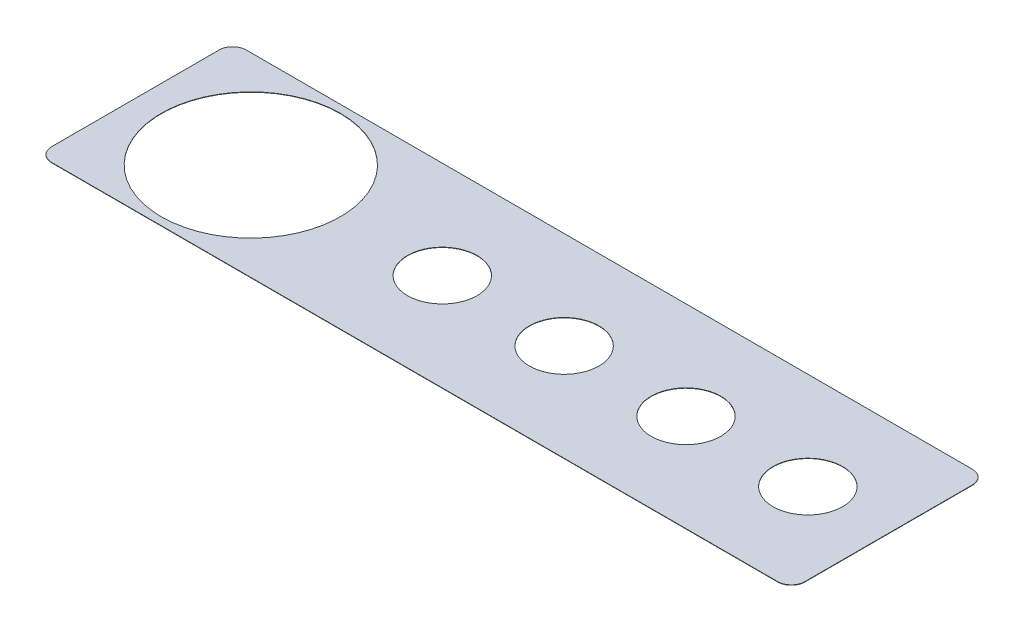
ISO-10303-21;
HEADER;
FILE_DESCRIPTION(('STEP AP214'),'2;1');
FILE_NAME('part.step','',(''),(''),'','','');
FILE_SCHEMA(('AUTOMOTIVE_DESIGN { 1 0 10303 214 1 1 1 1 }'));
ENDSEC;
DATA;
#1=APPLICATION_CONTEXT('core data for automotive mechanical design processes');
#2=APPLICATION_PROTOCOL_DEFINITION('international standard','automotive_design',2000,#1);
#3=PRODUCT_CONTEXT('',#1,'mechanical');
#4=PRODUCT('Part','Part','',(#3));
#5=PRODUCT_RELATED_PRODUCT_CATEGORY('part','',(#4));
#6=PRODUCT_DEFINITION_FORMATION('','',#4);
#7=PRODUCT_DEFINITION_CONTEXT('part definition',#1,'design');
#8=PRODUCT_DEFINITION('design','',#6,#7);
#9=PRODUCT_DEFINITION_SHAPE('','',#8);
#10=(LENGTH_UNIT() NAMED_UNIT(*) SI_UNIT(.MILLI.,.METRE.));
#11=(NAMED_UNIT(*) PLANE_ANGLE_UNIT() SI_UNIT($,.RADIAN.));
#12=(NAMED_UNIT(*) SI_UNIT($,.STERADIAN.) SOLID_ANGLE_UNIT());
#13=UNCERTAINTY_MEASURE_WITH_UNIT(LENGTH_MEASURE(1.E-05),#10,'distance_accuracy_value','');
#14=(GEOMETRIC_REPRESENTATION_CONTEXT(3) GLOBAL_UNCERTAINTY_ASSIGNED_CONTEXT((#13)) GLOBAL_UNIT_ASSIGNED_CONTEXT((#10,
#11,#12)) REPRESENTATION_CONTEXT('',''));
#15=CARTESIAN_POINT('',(0.,0.,0.));
#16=DIRECTION('',(0.,0.,1.));
#17=DIRECTION('',(1.,0.,0.));
#18=AXIS2_PLACEMENT_3D('',#15,#16,#17);
#19=CARTESIAN_POINT('',(-72.805846626015,0.1,-6.62830389262491));
#20=DIRECTION('',(0.,1.,0.));
#21=DIRECTION('',(0.,0.,1.));
#22=AXIS2_PLACEMENT_3D('',#19,#20,#21);
#23=PLANE('',#22);
#24=CARTESIAN_POINT('',(11.4619708276482,0.1,17.4315257475565));
#25=DIRECTION('',(0.,1.,0.));
#26=DIRECTION('',(0.,0.,1.));
#27=AXIS2_PLACEMENT_3D('',#24,#25,#26);
#28=CIRCLE('',#27,10.);
#29=CARTESIAN_POINT('',(11.4619708276482,0.1,27.4315257475565));
#30=VERTEX_POINT('',#29);
#31=EDGE_CURVE('E215',#30,#30,#28,.T.);
#32=ORIENTED_EDGE('',*,*,#31,.F.);
#33=EDGE_LOOP('',(#32));
#34=FACE_BOUND('',#33,.T.);
#35=CARTESIAN_POINT('',(46.4619708276482,0.1,17.4315257475565));
#36=DIRECTION('',(0.,1.,0.));
#37=DIRECTION('',(0.,0.,1.));
#38=AXIS2_PLACEMENT_3D('',#35,#36,#37);
#39=CIRCLE('',#38,10.);
#40=CARTESIAN_POINT('',(46.4619708276482,0.1,27.4315257475565));
#41=VERTEX_POINT('',#40);
#42=EDGE_CURVE('E222',#41,#41,#39,.T.);
#43=ORIENTED_EDGE('',*,*,#42,.F.);
#44=EDGE_LOOP('',(#43));
#45=FACE_BOUND('',#44,.T.);
#46=CARTESIAN_POINT('',(81.4619708276482,0.1,17.4315257475565));
#47=DIRECTION('',(0.,1.,0.));
#48=DIRECTION('',(0.,0.,1.));
#49=AXIS2_PLACEMENT_3D('',#46,#47,#48);
#50=CIRCLE('',#49,9.99999999999999);
#51=CARTESIAN_POINT('',(81.4619708276482,0.1,27.4315257475565));
#52=VERTEX_POINT('',#51);
#53=EDGE_CURVE('E226',#52,#52,#50,.T.);
#54=ORIENTED_EDGE('',*,*,#53,.F.);
#55=EDGE_LOOP('',(#54));
#56=FACE_BOUND('',#55,.T.);
#57=CARTESIAN_POINT('',(116.461970827648,0.1,17.4315257475565));
#58=DIRECTION('',(0.,1.,0.));
#59=DIRECTION('',(0.,0.,1.));
#60=AXIS2_PLACEMENT_3D('',#57,#58,#59);
#61=CIRCLE('',#60,10.);
#62=CARTESIAN_POINT('',(116.461970827648,0.1,27.4315257475565));
#63=VERTEX_POINT('',#62);
#64=EDGE_CURVE('E230',#63,#63,#61,.T.);
#65=ORIENTED_EDGE('',*,*,#64,.F.);
#66=EDGE_LOOP('',(#65));
#67=FACE_BOUND('',#66,.T.);
#68=CARTESIAN_POINT('',(-72.805846626015,0.1,-6.62830389262491));
#69=DIRECTION('',(0.,1.,0.));
#70=DIRECTION('',(0.,0.,1.));
#71=AXIS2_PLACEMENT_3D('',#68,#69,#70);
#72=CIRCLE('',#71,3.9);
#73=CARTESIAN_POINT('',(-72.805846626015,0.1,-10.5283038926249));
#74=VERTEX_POINT('',#73);
#75=CARTESIAN_POINT('',(-76.705846626015,0.1,-6.62830389262487));
#76=VERTEX_POINT('',#75);
#77=EDGE_CURVE('E166',#74,#76,#72,.T.);
#78=ORIENTED_EDGE('',*,*,#77,.T.);
#79=DIRECTION('',(0.,0.,1.));
#80=VECTOR('',#79,1.);
#81=CARTESIAN_POINT('',(-76.705846626015,0.1,-6.62830389262487));
#82=LINE('',#81,#80);
#83=CARTESIAN_POINT('',(-76.705846626015,0.1,41.4913553877378));
#84=VERTEX_POINT('',#83);
#85=EDGE_CURVE('E102',#76,#84,#82,.T.);
#86=ORIENTED_EDGE('',*,*,#85,.T.);
#87=CARTESIAN_POINT('',(-72.805846626015,0.1,41.4913553877379));
#88=DIRECTION('',(0.,1.,0.));
#89=DIRECTION('',(0.,0.,1.));
#90=AXIS2_PLACEMENT_3D('',#87,#88,#89);
#91=CIRCLE('',#90,3.9);
#92=CARTESIAN_POINT('',(-72.805846626015,0.1,45.3913553877379));
#93=VERTEX_POINT('',#92);
#94=EDGE_CURVE('E187',#84,#93,#91,.T.);
#95=ORIENTED_EDGE('',*,*,#94,.T.);
#96=DIRECTION('',(1.,0.,0.));
#97=VECTOR('',#96,1.);
#98=CARTESIAN_POINT('',(-72.805846626015,0.1,45.3913553877379));
#99=LINE('',#98,#97);
#100=CARTESIAN_POINT('',(135.779788281311,0.1,45.3913553877379));
#101=VERTEX_POINT('',#100);
#102=EDGE_CURVE('E201',#93,#101,#99,.T.);
#103=ORIENTED_EDGE('',*,*,#102,.T.);
#104=CARTESIAN_POINT('',(135.779788281311,0.1,41.4913553877379));
#105=DIRECTION('',(0.,1.,0.));
#106=DIRECTION('',(0.,0.,1.));
#107=AXIS2_PLACEMENT_3D('',#104,#105,#106);
#108=CIRCLE('',#107,3.90000000000001);
#109=CARTESIAN_POINT('',(139.679788281311,0.1,41.4913553877379));
#110=VERTEX_POINT('',#109);
#111=EDGE_CURVE('E121',#101,#110,#108,.T.);
#112=ORIENTED_EDGE('',*,*,#111,.T.);
#113=DIRECTION('',(0.,0.,-1.));
#114=VECTOR('',#113,1.);
#115=CARTESIAN_POINT('',(139.679788281311,0.1,41.4913553877379));
#116=LINE('',#115,#114);
#117=CARTESIAN_POINT('',(139.679788281311,0.1,-6.62830389262491));
#118=VERTEX_POINT('',#117);
#119=EDGE_CURVE('E115',#110,#118,#116,.T.);
#120=ORIENTED_EDGE('',*,*,#119,.T.);
#121=CARTESIAN_POINT('',(135.779788281311,0.1,-6.62830389262497));
#122=DIRECTION('',(0.,1.,0.));
#123=DIRECTION('',(0.,0.,1.));
#124=AXIS2_PLACEMENT_3D('',#121,#122,#123);
#125=CIRCLE('',#124,3.90000000000001);
#126=CARTESIAN_POINT('',(135.779788281311,0.1,-10.528303892625));
#127=VERTEX_POINT('',#126);
#128=EDGE_CURVE('E119',#118,#127,#125,.T.);
#129=ORIENTED_EDGE('',*,*,#128,.T.);
#130=DIRECTION('',(-1.,0.,0.));
#131=VECTOR('',#130,1.);
#132=CARTESIAN_POINT('',(135.779788281311,0.1,-10.528303892625));
#133=LINE('',#132,#131);
#134=EDGE_CURVE('E59',#127,#74,#133,.T.);
#135=ORIENTED_EDGE('',*,*,#134,.T.);
#136=EDGE_LOOP('',(#78,#86,#95,#103,#112,#120,#129,#135));
#137=FACE_BOUND('',#136,.T.);
#138=CARTESIAN_POINT('',(-43.5380291723518,0.1,17.4315257475565));
#139=DIRECTION('',(0.,1.,0.));
#140=DIRECTION('',(0.,0.,1.));
#141=AXIS2_PLACEMENT_3D('',#138,#139,#140);
#142=CIRCLE('',#141,25.7363341911249);
#143=CARTESIAN_POINT('',(-43.5380291723518,0.1,43.1678599386814));
#144=VERTEX_POINT('',#143);
#145=EDGE_CURVE('E148',#144,#144,#142,.T.);
#146=ORIENTED_EDGE('',*,*,#145,.F.);
#147=EDGE_LOOP('',(#146));
#148=FACE_BOUND('',#147,.T.);
#149=ADVANCED_FACE('F41',(#34,#45,#56,#67,#137,#148),#23,.T.);
#150=CARTESIAN_POINT('',(-72.805846626015,0.,-6.62830389262491));
#151=DIRECTION('',(0.,1.,0.));
#152=DIRECTION('',(0.,0.,1.));
#153=AXIS2_PLACEMENT_3D('',#150,#151,#152);
#154=PLANE('',#153);
#155=CARTESIAN_POINT('',(11.4619708276482,0.,17.4315257475565));
#156=DIRECTION('',(0.,1.,0.));
#157=DIRECTION('',(0.,0.,1.));
#158=AXIS2_PLACEMENT_3D('',#155,#156,#157);
#159=CIRCLE('',#158,10.);
#160=CARTESIAN_POINT('',(11.4619708276482,0.,27.4315257475565));
#161=VERTEX_POINT('',#160);
#162=EDGE_CURVE('E234',#161,#161,#159,.T.);
#163=ORIENTED_EDGE('',*,*,#162,.T.);
#164=EDGE_LOOP('',(#163));
#165=FACE_BOUND('',#164,.T.);
#166=CARTESIAN_POINT('',(46.4619708276482,0.,17.4315257475565));
#167=DIRECTION('',(0.,1.,0.));
#168=DIRECTION('',(0.,0.,1.));
#169=AXIS2_PLACEMENT_3D('',#166,#167,#168);
#170=CIRCLE('',#169,10.);
#171=CARTESIAN_POINT('',(46.4619708276482,0.,27.4315257475565));
#172=VERTEX_POINT('',#171);
#173=EDGE_CURVE('E243',#172,#172,#170,.T.);
#174=ORIENTED_EDGE('',*,*,#173,.T.);
#175=EDGE_LOOP('',(#174));
#176=FACE_BOUND('',#175,.T.);
#177=CARTESIAN_POINT('',(81.4619708276482,0.,17.4315257475565));
#178=DIRECTION('',(0.,1.,0.));
#179=DIRECTION('',(0.,0.,1.));
#180=AXIS2_PLACEMENT_3D('',#177,#178,#179);
#181=CIRCLE('',#180,9.99999999999999);
#182=CARTESIAN_POINT('',(81.4619708276482,0.,27.4315257475565));
#183=VERTEX_POINT('',#182);
#184=EDGE_CURVE('E239',#183,#183,#181,.T.);
#185=ORIENTED_EDGE('',*,*,#184,.T.);
#186=EDGE_LOOP('',(#185));
#187=FACE_BOUND('',#186,.T.);
#188=CARTESIAN_POINT('',(116.461970827648,0.,17.4315257475565));
#189=DIRECTION('',(0.,1.,0.));
#190=DIRECTION('',(0.,0.,1.));
#191=AXIS2_PLACEMENT_3D('',#188,#189,#190);
#192=CIRCLE('',#191,10.);
#193=CARTESIAN_POINT('',(116.461970827648,0.,27.4315257475565));
#194=VERTEX_POINT('',#193);
#195=EDGE_CURVE('E235',#194,#194,#192,.T.);
#196=ORIENTED_EDGE('',*,*,#195,.T.);
#197=EDGE_LOOP('',(#196));
#198=FACE_BOUND('',#197,.T.);
#199=CARTESIAN_POINT('',(-72.805846626015,0.,-6.62830389262491));
#200=DIRECTION('',(0.,1.,0.));
#201=DIRECTION('',(0.,0.,1.));
#202=AXIS2_PLACEMENT_3D('',#199,#200,#201);
#203=CIRCLE('',#202,3.9);
#204=CARTESIAN_POINT('',(-72.805846626015,0.,-10.5283038926249));
#205=VERTEX_POINT('',#204);
#206=CARTESIAN_POINT('',(-76.705846626015,0.,-6.62830389262487));
#207=VERTEX_POINT('',#206);
#208=EDGE_CURVE('E143',#205,#207,#203,.T.);
#209=ORIENTED_EDGE('',*,*,#208,.F.);
#210=DIRECTION('',(-1.,0.,0.));
#211=VECTOR('',#210,1.);
#212=CARTESIAN_POINT('',(135.779788281311,0.,-10.528303892625));
#213=LINE('',#212,#211);
#214=CARTESIAN_POINT('',(135.779788281311,0.,-10.528303892625));
#215=VERTEX_POINT('',#214);
#216=EDGE_CURVE('E94',#215,#205,#213,.T.);
#217=ORIENTED_EDGE('',*,*,#216,.F.);
#218=CARTESIAN_POINT('',(135.779788281311,0.,-6.62830389262497));
#219=DIRECTION('',(0.,1.,0.));
#220=DIRECTION('',(0.,0.,1.));
#221=AXIS2_PLACEMENT_3D('',#218,#219,#220);
#222=CIRCLE('',#221,3.90000000000001);
#223=CARTESIAN_POINT('',(139.679788281311,0.,-6.62830389262491));
#224=VERTEX_POINT('',#223);
#225=EDGE_CURVE('E88',#224,#215,#222,.T.);
#226=ORIENTED_EDGE('',*,*,#225,.F.);
#227=DIRECTION('',(0.,0.,-1.));
#228=VECTOR('',#227,1.);
#229=CARTESIAN_POINT('',(139.679788281311,0.,41.4913553877379));
#230=LINE('',#229,#228);
#231=CARTESIAN_POINT('',(139.679788281311,0.,41.4913553877379));
#232=VERTEX_POINT('',#231);
#233=EDGE_CURVE('E130',#232,#224,#230,.T.);
#234=ORIENTED_EDGE('',*,*,#233,.F.);
#235=CARTESIAN_POINT('',(135.779788281311,0.,41.4913553877379));
#236=DIRECTION('',(0.,1.,0.));
#237=DIRECTION('',(0.,0.,1.));
#238=AXIS2_PLACEMENT_3D('',#235,#236,#237);
#239=CIRCLE('',#238,3.90000000000001);
#240=CARTESIAN_POINT('',(135.779788281311,0.,45.3913553877379));
#241=VERTEX_POINT('',#240);
#242=EDGE_CURVE('E157',#241,#232,#239,.T.);
#243=ORIENTED_EDGE('',*,*,#242,.F.);
#244=DIRECTION('',(1.,0.,0.));
#245=VECTOR('',#244,1.);
#246=CARTESIAN_POINT('',(-72.805846626015,0.,45.3913553877379));
#247=LINE('',#246,#245);
#248=CARTESIAN_POINT('',(-72.805846626015,0.,45.3913553877379));
#249=VERTEX_POINT('',#248);
#250=EDGE_CURVE('E154',#249,#241,#247,.T.);
#251=ORIENTED_EDGE('',*,*,#250,.F.);
#252=CARTESIAN_POINT('',(-72.805846626015,0.,41.4913553877379));
#253=DIRECTION('',(0.,1.,0.));
#254=DIRECTION('',(0.,0.,1.));
#255=AXIS2_PLACEMENT_3D('',#252,#253,#254);
#256=CIRCLE('',#255,3.9);
#257=CARTESIAN_POINT('',(-76.705846626015,0.,41.4913553877378));
#258=VERTEX_POINT('',#257);
#259=EDGE_CURVE('E151',#258,#249,#256,.T.);
#260=ORIENTED_EDGE('',*,*,#259,.F.);
#261=DIRECTION('',(0.,0.,1.));
#262=VECTOR('',#261,1.);
#263=CARTESIAN_POINT('',(-76.705846626015,0.,-6.62830389262487));
#264=LINE('',#263,#262);
#265=EDGE_CURVE('E147',#207,#258,#264,.T.);
#266=ORIENTED_EDGE('',*,*,#265,.F.);
#267=EDGE_LOOP('',(#209,#217,#226,#234,#243,#251,#260,#266));
#268=FACE_BOUND('',#267,.T.);
#269=CARTESIAN_POINT('',(-43.5380291723518,0.,17.4315257475565));
#270=DIRECTION('',(0.,1.,0.));
#271=DIRECTION('',(0.,0.,1.));
#272=AXIS2_PLACEMENT_3D('',#269,#270,#271);
#273=CIRCLE('',#272,25.7363341911249);
#274=CARTESIAN_POINT('',(-43.5380291723518,0.,43.1678599386814));
#275=VERTEX_POINT('',#274);
#276=EDGE_CURVE('E211',#275,#275,#273,.T.);
#277=ORIENTED_EDGE('',*,*,#276,.T.);
#278=EDGE_LOOP('',(#277));
#279=FACE_BOUND('',#278,.T.);
#280=ADVANCED_FACE('F191',(#165,#176,#187,#198,#268,#279),#154,.F.);
#281=CARTESIAN_POINT('',(-72.805846626015,0.1,-6.62830389262491));
#282=DIRECTION('',(0.,-1.,0.));
#283=DIRECTION('',(0.,0.,-1.));
#284=AXIS2_PLACEMENT_3D('',#281,#282,#283);
#285=CYLINDRICAL_SURFACE('',#284,3.9);
#286=ORIENTED_EDGE('',*,*,#208,.T.);
#287=DIRECTION('',(0.,-1.,0.));
#288=VECTOR('',#287,1.);
#289=CARTESIAN_POINT('',(-76.705846626015,0.1,-6.62830389262487));
#290=LINE('',#289,#288);
#291=EDGE_CURVE('E11',#76,#207,#290,.T.);
#292=ORIENTED_EDGE('',*,*,#291,.F.);
#293=ORIENTED_EDGE('',*,*,#77,.F.);
#294=DIRECTION('',(0.,-1.,0.));
#295=VECTOR('',#294,1.);
#296=CARTESIAN_POINT('',(-72.805846626015,0.1,-10.5283038926249));
#297=LINE('',#296,#295);
#298=EDGE_CURVE('E139',#74,#205,#297,.T.);
#299=ORIENTED_EDGE('',*,*,#298,.T.);
#300=EDGE_LOOP('',(#286,#292,#293,#299));
#301=FACE_BOUND('',#300,.T.);
#302=ADVANCED_FACE('F43',(#301),#285,.T.);
#303=CARTESIAN_POINT('',(-76.705846626015,0.1,-6.62830389262487));
#304=DIRECTION('',(1.,0.,0.));
#305=DIRECTION('',(0.,0.,-1.));
#306=AXIS2_PLACEMENT_3D('',#303,#304,#305);
#307=PLANE('',#306);
#308=ORIENTED_EDGE('',*,*,#265,.T.);
#309=DIRECTION('',(0.,-1.,0.));
#310=VECTOR('',#309,1.);
#311=CARTESIAN_POINT('',(-76.705846626015,0.1,41.4913553877378));
#312=LINE('',#311,#310);
#313=EDGE_CURVE('E51',#84,#258,#312,.T.);
#314=ORIENTED_EDGE('',*,*,#313,.F.);
#315=ORIENTED_EDGE('',*,*,#85,.F.);
#316=ORIENTED_EDGE('',*,*,#291,.T.);
#317=EDGE_LOOP('',(#308,#314,#315,#316));
#318=FACE_BOUND('',#317,.T.);
#319=ADVANCED_FACE('F290',(#318),#307,.F.);
#320=CARTESIAN_POINT('',(-72.805846626015,0.1,41.4913553877379));
#321=DIRECTION('',(0.,-1.,0.));
#322=DIRECTION('',(0.,0.,-1.));
#323=AXIS2_PLACEMENT_3D('',#320,#321,#322);
#324=CYLINDRICAL_SURFACE('',#323,3.9);
#325=ORIENTED_EDGE('',*,*,#259,.T.);
#326=DIRECTION('',(0.,-1.,0.));
#327=VECTOR('',#326,1.);
#328=CARTESIAN_POINT('',(-72.805846626015,0.1,45.3913553877379));
#329=LINE('',#328,#327);
#330=EDGE_CURVE('E177',#93,#249,#329,.T.);
#331=ORIENTED_EDGE('',*,*,#330,.F.);
#332=ORIENTED_EDGE('',*,*,#94,.F.);
#333=ORIENTED_EDGE('',*,*,#313,.T.);
#334=EDGE_LOOP('',(#325,#331,#332,#333));
#335=FACE_BOUND('',#334,.T.);
#336=ADVANCED_FACE('F185',(#335),#324,.T.);
#337=CARTESIAN_POINT('',(-72.805846626015,0.1,45.3913553877379));
#338=DIRECTION('',(0.,0.,-1.));
#339=DIRECTION('',(-1.,0.,0.));
#340=AXIS2_PLACEMENT_3D('',#337,#338,#339);
#341=PLANE('',#340);
#342=ORIENTED_EDGE('',*,*,#250,.T.);
#343=DIRECTION('',(0.,-1.,0.));
#344=VECTOR('',#343,1.);
#345=CARTESIAN_POINT('',(135.779788281311,0.1,45.3913553877379));
#346=LINE('',#345,#344);
#347=EDGE_CURVE('E173',#101,#241,#346,.T.);
#348=ORIENTED_EDGE('',*,*,#347,.F.);
#349=ORIENTED_EDGE('',*,*,#102,.F.);
#350=ORIENTED_EDGE('',*,*,#330,.T.);
#351=EDGE_LOOP('',(#342,#348,#349,#350));
#352=FACE_BOUND('',#351,.T.);
#353=ADVANCED_FACE('F196',(#352),#341,.F.);
#354=CARTESIAN_POINT('',(135.779788281311,0.1,41.4913553877379));
#355=DIRECTION('',(0.,-1.,0.));
#356=DIRECTION('',(0.,0.,-1.));
#357=AXIS2_PLACEMENT_3D('',#354,#355,#356);
#358=CYLINDRICAL_SURFACE('',#357,3.90000000000001);
#359=ORIENTED_EDGE('',*,*,#242,.T.);
#360=DIRECTION('',(0.,-1.,0.));
#361=VECTOR('',#360,1.);
#362=CARTESIAN_POINT('',(139.679788281311,0.1,41.4913553877379));
#363=LINE('',#362,#361);
#364=EDGE_CURVE('E132',#110,#232,#363,.T.);
#365=ORIENTED_EDGE('',*,*,#364,.F.);
#366=ORIENTED_EDGE('',*,*,#111,.F.);
#367=ORIENTED_EDGE('',*,*,#347,.T.);
#368=EDGE_LOOP('',(#359,#365,#366,#367));
#369=FACE_BOUND('',#368,.T.);
#370=ADVANCED_FACE('F199',(#369),#358,.T.);
#371=CARTESIAN_POINT('',(139.679788281311,0.1,41.4913553877379));
#372=DIRECTION('',(-1.,0.,0.));
#373=DIRECTION('',(0.,0.,1.));
#374=AXIS2_PLACEMENT_3D('',#371,#372,#373);
#375=PLANE('',#374);
#376=ORIENTED_EDGE('',*,*,#233,.T.);
#377=DIRECTION('',(0.,-1.,0.));
#378=VECTOR('',#377,1.);
#379=CARTESIAN_POINT('',(139.679788281311,0.1,-6.62830389262491));
#380=LINE('',#379,#378);
#381=EDGE_CURVE('E127',#118,#224,#380,.T.);
#382=ORIENTED_EDGE('',*,*,#381,.F.);
#383=ORIENTED_EDGE('',*,*,#119,.F.);
#384=ORIENTED_EDGE('',*,*,#364,.T.);
#385=EDGE_LOOP('',(#376,#382,#383,#384));
#386=FACE_BOUND('',#385,.T.);
#387=ADVANCED_FACE('F128',(#386),#375,.F.);
#388=CARTESIAN_POINT('',(135.779788281311,0.1,-6.62830389262497));
#389=DIRECTION('',(0.,-1.,0.));
#390=DIRECTION('',(0.,0.,-1.));
#391=AXIS2_PLACEMENT_3D('',#388,#389,#390);
#392=CYLINDRICAL_SURFACE('',#391,3.90000000000001);
#393=ORIENTED_EDGE('',*,*,#225,.T.);
#394=DIRECTION('',(0.,-1.,0.));
#395=VECTOR('',#394,1.);
#396=CARTESIAN_POINT('',(135.779788281311,0.1,-10.528303892625));
#397=LINE('',#396,#395);
#398=EDGE_CURVE('E133',#127,#215,#397,.T.);
#399=ORIENTED_EDGE('',*,*,#398,.F.);
#400=ORIENTED_EDGE('',*,*,#128,.F.);
#401=ORIENTED_EDGE('',*,*,#381,.T.);
#402=EDGE_LOOP('',(#393,#399,#400,#401));
#403=FACE_BOUND('',#402,.T.);
#404=ADVANCED_FACE('F135',(#403),#392,.T.);
#405=CARTESIAN_POINT('',(135.779788281311,0.1,-10.528303892625));
#406=DIRECTION('',(0.,0.,1.));
#407=DIRECTION('',(1.,0.,0.));
#408=AXIS2_PLACEMENT_3D('',#405,#406,#407);
#409=PLANE('',#408);
#410=ORIENTED_EDGE('',*,*,#216,.T.);
#411=ORIENTED_EDGE('',*,*,#298,.F.);
#412=ORIENTED_EDGE('',*,*,#134,.F.);
#413=ORIENTED_EDGE('',*,*,#398,.T.);
#414=EDGE_LOOP('',(#410,#411,#412,#413));
#415=FACE_BOUND('',#414,.T.);
#416=ADVANCED_FACE('F278',(#415),#409,.F.);
#417=CARTESIAN_POINT('',(-43.5380291723518,0.1,17.4315257475565));
#418=DIRECTION('',(0.,-1.,0.));
#419=DIRECTION('',(0.,0.,-1.));
#420=AXIS2_PLACEMENT_3D('',#417,#418,#419);
#421=CYLINDRICAL_SURFACE('',#420,25.7363341911249);
#422=ORIENTED_EDGE('',*,*,#145,.T.);
#423=EDGE_LOOP('',(#422));
#424=FACE_BOUND('',#423,.T.);
#425=ORIENTED_EDGE('',*,*,#276,.F.);
#426=EDGE_LOOP('',(#425));
#427=FACE_BOUND('',#426,.T.);
#428=ADVANCED_FACE('F275',(#424,#427),#421,.F.);
#429=CARTESIAN_POINT('',(116.461970827648,0.,17.4315257475565));
#430=DIRECTION('',(0.,1.,0.));
#431=DIRECTION('',(0.,0.,1.));
#432=AXIS2_PLACEMENT_3D('',#429,#430,#431);
#433=CYLINDRICAL_SURFACE('',#432,10.);
#434=ORIENTED_EDGE('',*,*,#64,.T.);
#435=EDGE_LOOP('',(#434));
#436=FACE_BOUND('',#435,.T.);
#437=ORIENTED_EDGE('',*,*,#195,.F.);
#438=EDGE_LOOP('',(#437));
#439=FACE_BOUND('',#438,.T.);
#440=ADVANCED_FACE('F313',(#436,#439),#433,.F.);
#441=CARTESIAN_POINT('',(81.4619708276482,0.,17.4315257475565));
#442=DIRECTION('',(0.,1.,0.));
#443=DIRECTION('',(0.,0.,1.));
#444=AXIS2_PLACEMENT_3D('',#441,#442,#443);
#445=CYLINDRICAL_SURFACE('',#444,9.99999999999999);
#446=ORIENTED_EDGE('',*,*,#53,.T.);
#447=EDGE_LOOP('',(#446));
#448=FACE_BOUND('',#447,.T.);
#449=ORIENTED_EDGE('',*,*,#184,.F.);
#450=EDGE_LOOP('',(#449));
#451=FACE_BOUND('',#450,.T.);
#452=ADVANCED_FACE('F261',(#448,#451),#445,.F.);
#453=CARTESIAN_POINT('',(46.4619708276482,0.,17.4315257475565));
#454=DIRECTION('',(0.,1.,0.));
#455=DIRECTION('',(0.,0.,1.));
#456=AXIS2_PLACEMENT_3D('',#453,#454,#455);
#457=CYLINDRICAL_SURFACE('',#456,10.);
#458=ORIENTED_EDGE('',*,*,#42,.T.);
#459=EDGE_LOOP('',(#458));
#460=FACE_BOUND('',#459,.T.);
#461=ORIENTED_EDGE('',*,*,#173,.F.);
#462=EDGE_LOOP('',(#461));
#463=FACE_BOUND('',#462,.T.);
#464=ADVANCED_FACE('F255',(#460,#463),#457,.F.);
#465=CARTESIAN_POINT('',(11.4619708276482,0.,17.4315257475565));
#466=DIRECTION('',(0.,1.,0.));
#467=DIRECTION('',(0.,0.,1.));
#468=AXIS2_PLACEMENT_3D('',#465,#466,#467);
#469=CYLINDRICAL_SURFACE('',#468,10.);
#470=ORIENTED_EDGE('',*,*,#31,.T.);
#471=EDGE_LOOP('',(#470));
#472=FACE_BOUND('',#471,.T.);
#473=ORIENTED_EDGE('',*,*,#162,.F.);
#474=EDGE_LOOP('',(#473));
#475=FACE_BOUND('',#474,.T.);
#476=ADVANCED_FACE('F253',(#472,#475),#469,.F.);
#477=CLOSED_SHELL('',(#149,#280,#302,#319,#336,#353,#370,#387,#404,#416,#428,#440,#452,#464,#476));
#478=MANIFOLD_SOLID_BREP('B2',#477);
#479=ADVANCED_BREP_SHAPE_REPRESENTATION('',(#18,#478),#14);
#480=SHAPE_DEFINITION_REPRESENTATION(#9,#479);
ENDSEC;
END-ISO-10303-21;
